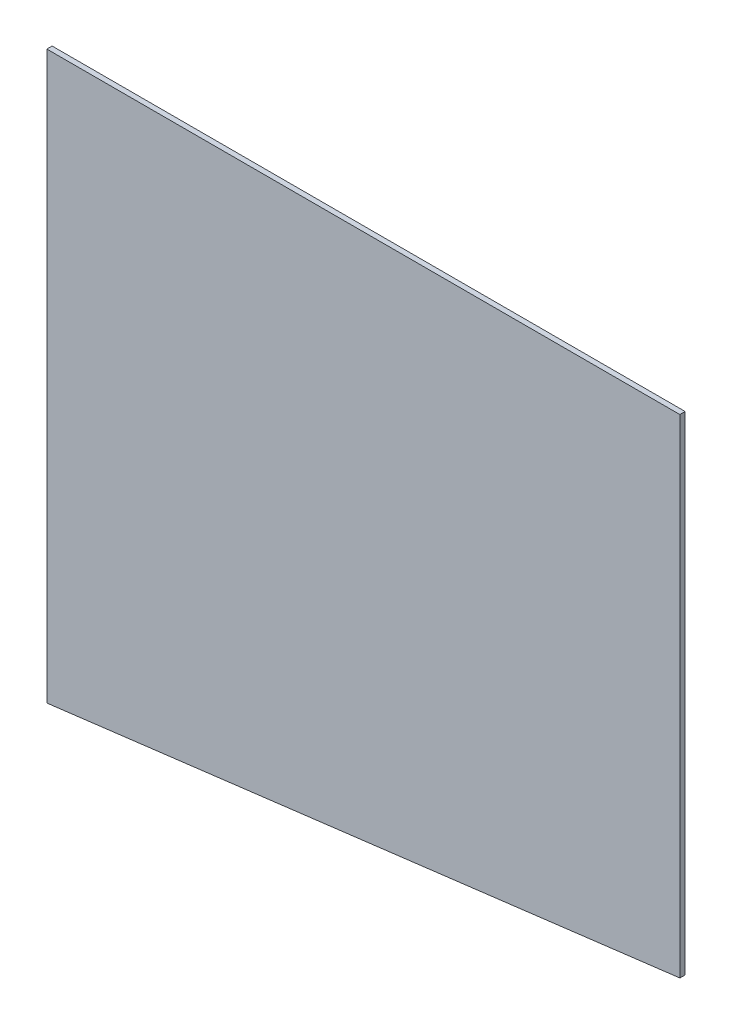
ISO-10303-21;
HEADER;
FILE_DESCRIPTION(('STEP AP214'),'2;1');
FILE_NAME('part.step','',(''),(''),'','','');
FILE_SCHEMA(('AUTOMOTIVE_DESIGN { 1 0 10303 214 1 1 1 1 }'));
ENDSEC;
DATA;
#1=APPLICATION_CONTEXT('core data for automotive mechanical design processes');
#2=APPLICATION_PROTOCOL_DEFINITION('international standard','automotive_design',2000,#1);
#3=PRODUCT_CONTEXT('',#1,'mechanical');
#4=PRODUCT('Part','Part','',(#3));
#5=PRODUCT_RELATED_PRODUCT_CATEGORY('part','',(#4));
#6=PRODUCT_DEFINITION_FORMATION('','',#4);
#7=PRODUCT_DEFINITION_CONTEXT('part definition',#1,'design');
#8=PRODUCT_DEFINITION('design','',#6,#7);
#9=PRODUCT_DEFINITION_SHAPE('','',#8);
#10=(LENGTH_UNIT() NAMED_UNIT(*) SI_UNIT(.MILLI.,.METRE.));
#11=(NAMED_UNIT(*) PLANE_ANGLE_UNIT() SI_UNIT($,.RADIAN.));
#12=(NAMED_UNIT(*) SI_UNIT($,.STERADIAN.) SOLID_ANGLE_UNIT());
#13=UNCERTAINTY_MEASURE_WITH_UNIT(LENGTH_MEASURE(1.E-05),#10,'distance_accuracy_value','');
#14=(GEOMETRIC_REPRESENTATION_CONTEXT(3) GLOBAL_UNCERTAINTY_ASSIGNED_CONTEXT((#13)) GLOBAL_UNIT_ASSIGNED_CONTEXT((#10,
#11,#12)) REPRESENTATION_CONTEXT('',''));
#15=CARTESIAN_POINT('',(0.,0.,0.));
#16=DIRECTION('',(0.,0.,1.));
#17=DIRECTION('',(1.,0.,0.));
#18=AXIS2_PLACEMENT_3D('',#15,#16,#17);
#19=CARTESIAN_POINT('',(299.490005302849,-401.429379744161,2.));
#20=DIRECTION('',(-1.,0.,0.));
#21=DIRECTION('',(0.,0.,1.));
#22=AXIS2_PLACEMENT_3D('',#19,#20,#21);
#23=PLANE('',#22);
#24=DIRECTION('',(0.,1.,0.));
#25=VECTOR('',#24,1.);
#26=CARTESIAN_POINT('',(299.490005302849,-401.429379744161,0.));
#27=LINE('',#26,#25);
#28=CARTESIAN_POINT('',(299.490005302849,-401.429379744161,0.));
#29=VERTEX_POINT('',#28);
#30=CARTESIAN_POINT('',(299.490005302849,-216.429379744161,0.));
#31=VERTEX_POINT('',#30);
#32=EDGE_CURVE('E96',#29,#31,#27,.T.);
#33=ORIENTED_EDGE('',*,*,#32,.T.);
#34=DIRECTION('',(0.,0.,-1.));
#35=VECTOR('',#34,1.);
#36=CARTESIAN_POINT('',(299.490005302849,-216.429379744161,2.));
#37=LINE('',#36,#35);
#38=CARTESIAN_POINT('',(299.490005302849,-216.429379744161,2.));
#39=VERTEX_POINT('',#38);
#40=EDGE_CURVE('E11',#39,#31,#37,.T.);
#41=ORIENTED_EDGE('',*,*,#40,.F.);
#42=DIRECTION('',(0.,1.,0.));
#43=VECTOR('',#42,1.);
#44=CARTESIAN_POINT('',(299.490005302849,-401.429379744161,2.));
#45=LINE('',#44,#43);
#46=CARTESIAN_POINT('',(299.490005302849,-401.429379744161,2.));
#47=VERTEX_POINT('',#46);
#48=EDGE_CURVE('E84',#47,#39,#45,.T.);
#49=ORIENTED_EDGE('',*,*,#48,.F.);
#50=DIRECTION('',(0.,0.,-1.));
#51=VECTOR('',#50,1.);
#52=CARTESIAN_POINT('',(299.490005302849,-401.429379744161,2.));
#53=LINE('',#52,#51);
#54=EDGE_CURVE('E92',#47,#29,#53,.T.);
#55=ORIENTED_EDGE('',*,*,#54,.T.);
#56=EDGE_LOOP('',(#33,#41,#49,#55));
#57=FACE_BOUND('',#56,.T.);
#58=ADVANCED_FACE('F33',(#57),#23,.F.);
#59=CARTESIAN_POINT('',(299.490005302849,-216.429379744161,2.));
#60=DIRECTION('',(0.,-1.,0.));
#61=DIRECTION('',(1.,0.,0.));
#62=AXIS2_PLACEMENT_3D('',#59,#60,#61);
#63=PLANE('',#62);
#64=DIRECTION('',(-1.,0.,0.));
#65=VECTOR('',#64,1.);
#66=CARTESIAN_POINT('',(299.490005302849,-216.429379744161,0.));
#67=LINE('',#66,#65);
#68=CARTESIAN_POINT('',(59.490005302849,-216.429379744161,0.));
#69=VERTEX_POINT('',#68);
#70=EDGE_CURVE('E88',#31,#69,#67,.T.);
#71=ORIENTED_EDGE('',*,*,#70,.T.);
#72=DIRECTION('',(0.,0.,-1.));
#73=VECTOR('',#72,1.);
#74=CARTESIAN_POINT('',(59.490005302849,-216.429379744161,2.));
#75=LINE('',#74,#73);
#76=CARTESIAN_POINT('',(59.490005302849,-216.429379744161,2.));
#77=VERTEX_POINT('',#76);
#78=EDGE_CURVE('E41',#77,#69,#75,.T.);
#79=ORIENTED_EDGE('',*,*,#78,.F.);
#80=DIRECTION('',(-1.,0.,0.));
#81=VECTOR('',#80,1.);
#82=CARTESIAN_POINT('',(299.490005302849,-216.429379744161,2.));
#83=LINE('',#82,#81);
#84=EDGE_CURVE('E79',#39,#77,#83,.T.);
#85=ORIENTED_EDGE('',*,*,#84,.F.);
#86=ORIENTED_EDGE('',*,*,#40,.T.);
#87=EDGE_LOOP('',(#71,#79,#85,#86));
#88=FACE_BOUND('',#87,.T.);
#89=ADVANCED_FACE('F87',(#88),#63,.F.);
#90=CARTESIAN_POINT('',(59.490005302849,-216.429379744161,2.));
#91=DIRECTION('',(1.,0.,0.));
#92=DIRECTION('',(0.,1.,0.));
#93=AXIS2_PLACEMENT_3D('',#90,#91,#92);
#94=PLANE('',#93);
#95=DIRECTION('',(0.,-1.,0.));
#96=VECTOR('',#95,1.);
#97=CARTESIAN_POINT('',(59.490005302849,-216.429379744161,0.));
#98=LINE('',#97,#96);
#99=CARTESIAN_POINT('',(59.490005302849,-431.155431781328,0.));
#100=VERTEX_POINT('',#99);
#101=EDGE_CURVE('E66',#69,#100,#98,.T.);
#102=ORIENTED_EDGE('',*,*,#101,.T.);
#103=DIRECTION('',(0.,0.,-1.));
#104=VECTOR('',#103,1.);
#105=CARTESIAN_POINT('',(59.490005302849,-431.155431781328,2.));
#106=LINE('',#105,#104);
#107=CARTESIAN_POINT('',(59.490005302849,-431.155431781328,2.));
#108=VERTEX_POINT('',#107);
#109=EDGE_CURVE('E89',#108,#100,#106,.T.);
#110=ORIENTED_EDGE('',*,*,#109,.F.);
#111=DIRECTION('',(0.,-1.,0.));
#112=VECTOR('',#111,1.);
#113=CARTESIAN_POINT('',(59.490005302849,-216.429379744161,2.));
#114=LINE('',#113,#112);
#115=EDGE_CURVE('E82',#77,#108,#114,.T.);
#116=ORIENTED_EDGE('',*,*,#115,.F.);
#117=ORIENTED_EDGE('',*,*,#78,.T.);
#118=EDGE_LOOP('',(#102,#110,#116,#117));
#119=FACE_BOUND('',#118,.T.);
#120=ADVANCED_FACE('F90',(#119),#94,.F.);
#121=CARTESIAN_POINT('',(299.490005302849,-401.429379744161,2.));
#122=DIRECTION('',(-0.12291928997424,0.992416670633978,0.));
#123=DIRECTION('',(-0.992416670633978,-0.12291928997424,0.));
#124=AXIS2_PLACEMENT_3D('',#121,#122,#123);
#125=PLANE('',#124);
#126=DIRECTION('',(0.992416670633977,0.12291928997424,0.));
#127=VECTOR('',#126,1.);
#128=CARTESIAN_POINT('',(299.490005302849,-401.429379744161,0.));
#129=LINE('',#128,#127);
#130=EDGE_CURVE('E72',#100,#29,#129,.T.);
#131=ORIENTED_EDGE('',*,*,#130,.T.);
#132=ORIENTED_EDGE('',*,*,#54,.F.);
#133=DIRECTION('',(0.992416670633977,0.12291928997424,0.));
#134=VECTOR('',#133,1.);
#135=CARTESIAN_POINT('',(299.490005302849,-401.429379744161,2.));
#136=LINE('',#135,#134);
#137=EDGE_CURVE('E49',#108,#47,#136,.T.);
#138=ORIENTED_EDGE('',*,*,#137,.F.);
#139=ORIENTED_EDGE('',*,*,#109,.T.);
#140=EDGE_LOOP('',(#131,#132,#138,#139));
#141=FACE_BOUND('',#140,.T.);
#142=ADVANCED_FACE('F103',(#141),#125,.F.);
#143=CARTESIAN_POINT('',(0.,0.,2.));
#144=DIRECTION('',(0.,0.,1.));
#145=DIRECTION('',(1.,0.,0.));
#146=AXIS2_PLACEMENT_3D('',#143,#144,#145);
#147=PLANE('',#146);
#148=ORIENTED_EDGE('',*,*,#48,.T.);
#149=ORIENTED_EDGE('',*,*,#84,.T.);
#150=ORIENTED_EDGE('',*,*,#115,.T.);
#151=ORIENTED_EDGE('',*,*,#137,.T.);
#152=EDGE_LOOP('',(#148,#149,#150,#151));
#153=FACE_BOUND('',#152,.T.);
#154=ADVANCED_FACE('F80',(#153),#147,.T.);
#155=CARTESIAN_POINT('',(0.,0.,0.));
#156=DIRECTION('',(0.,0.,1.));
#157=DIRECTION('',(1.,0.,0.));
#158=AXIS2_PLACEMENT_3D('',#155,#156,#157);
#159=PLANE('',#158);
#160=ORIENTED_EDGE('',*,*,#32,.F.);
#161=ORIENTED_EDGE('',*,*,#130,.F.);
#162=ORIENTED_EDGE('',*,*,#101,.F.);
#163=ORIENTED_EDGE('',*,*,#70,.F.);
#164=EDGE_LOOP('',(#160,#161,#162,#163));
#165=FACE_BOUND('',#164,.T.);
#166=ADVANCED_FACE('F106',(#165),#159,.F.);
#167=CLOSED_SHELL('',(#58,#89,#120,#142,#154,#166));
#168=MANIFOLD_SOLID_BREP('B2',#167);
#169=ADVANCED_BREP_SHAPE_REPRESENTATION('',(#18,#168),#14);
#170=SHAPE_DEFINITION_REPRESENTATION(#9,#169);
ENDSEC;
END-ISO-10303-21;
